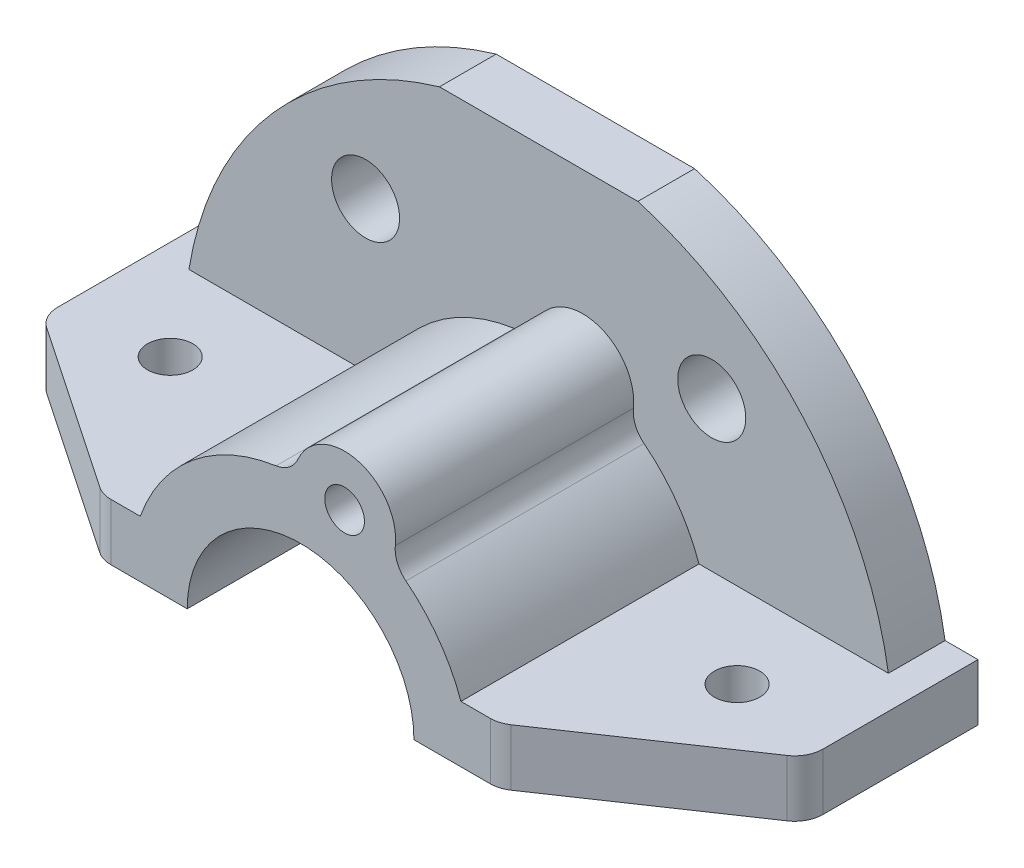
ISO-10303-21;
HEADER;
FILE_DESCRIPTION(('STEP AP214'),'2;1');
FILE_NAME('part.step','',(''),(''),'','','');
FILE_SCHEMA(('AUTOMOTIVE_DESIGN { 1 0 10303 214 1 1 1 1 }'));
ENDSEC;
DATA;
#1=APPLICATION_CONTEXT('core data for automotive mechanical design processes');
#2=APPLICATION_PROTOCOL_DEFINITION('international standard','automotive_design',2000,#1);
#3=PRODUCT_CONTEXT('',#1,'mechanical');
#4=PRODUCT('Part','Part','',(#3));
#5=PRODUCT_RELATED_PRODUCT_CATEGORY('part','',(#4));
#6=PRODUCT_DEFINITION_FORMATION('','',#4);
#7=PRODUCT_DEFINITION_CONTEXT('part definition',#1,'design');
#8=PRODUCT_DEFINITION('design','',#6,#7);
#9=PRODUCT_DEFINITION_SHAPE('','',#8);
#10=(LENGTH_UNIT() NAMED_UNIT(*) SI_UNIT(.MILLI.,.METRE.));
#11=(NAMED_UNIT(*) PLANE_ANGLE_UNIT() SI_UNIT($,.RADIAN.));
#12=(NAMED_UNIT(*) SI_UNIT($,.STERADIAN.) SOLID_ANGLE_UNIT());
#13=UNCERTAINTY_MEASURE_WITH_UNIT(LENGTH_MEASURE(1.E-05),#10,'distance_accuracy_value','');
#14=(GEOMETRIC_REPRESENTATION_CONTEXT(3) GLOBAL_UNCERTAINTY_ASSIGNED_CONTEXT((#13)) GLOBAL_UNIT_ASSIGNED_CONTEXT((#10,
#11,#12)) REPRESENTATION_CONTEXT('',''));
#15=CARTESIAN_POINT('',(0.,0.,0.));
#16=DIRECTION('',(0.,0.,1.));
#17=DIRECTION('',(1.,0.,0.));
#18=AXIS2_PLACEMENT_3D('',#15,#16,#17);
#19=CARTESIAN_POINT('',(67.5,9.99999999999999,-52.));
#20=DIRECTION('',(1.,0.,0.));
#21=DIRECTION('',(0.,0.,-1.));
#22=AXIS2_PLACEMENT_3D('',#19,#20,#21);
#23=PLANE('',#22);
#24=DIRECTION('',(0.,0.,1.));
#25=VECTOR('',#24,1.);
#26=CARTESIAN_POINT('',(67.5,9.99999999999999,-52.));
#27=LINE('',#26,#25);
#28=CARTESIAN_POINT('',(67.5,9.99999999999999,-52.));
#29=VERTEX_POINT('',#28);
#30=CARTESIAN_POINT('',(67.5,9.99999999999999,-24.6532336779047));
#31=VERTEX_POINT('',#30);
#32=EDGE_CURVE('E297',#29,#31,#27,.T.);
#33=ORIENTED_EDGE('',*,*,#32,.T.);
#34=DIRECTION('',(0.,-1.,0.));
#35=VECTOR('',#34,1.);
#36=CARTESIAN_POINT('',(67.5,9.99999999999999,-24.6532336779047));
#37=LINE('',#36,#35);
#38=CARTESIAN_POINT('',(67.5,0.,-24.6532336779047));
#39=VERTEX_POINT('',#38);
#40=EDGE_CURVE('E327',#31,#39,#37,.T.);
#41=ORIENTED_EDGE('',*,*,#40,.T.);
#42=DIRECTION('',(0.,0.,1.));
#43=VECTOR('',#42,1.);
#44=CARTESIAN_POINT('',(67.5,0.,-52.));
#45=LINE('',#44,#43);
#46=CARTESIAN_POINT('',(67.5,0.,-52.));
#47=VERTEX_POINT('',#46);
#48=EDGE_CURVE('E302',#47,#39,#45,.T.);
#49=ORIENTED_EDGE('',*,*,#48,.F.);
#50=DIRECTION('',(0.,1.,0.));
#51=VECTOR('',#50,1.);
#52=CARTESIAN_POINT('',(67.5,9.99999999999999,-52.));
#53=LINE('',#52,#51);
#54=EDGE_CURVE('E267',#47,#29,#53,.T.);
#55=ORIENTED_EDGE('',*,*,#54,.T.);
#56=EDGE_LOOP('',(#33,#41,#49,#55));
#57=FACE_BOUND('',#56,.T.);
#58=ADVANCED_FACE('F41',(#57),#23,.T.);
#59=CARTESIAN_POINT('',(0.,0.,0.));
#60=DIRECTION('',(0.,0.,1.));
#61=DIRECTION('',(1.,0.,0.));
#62=AXIS2_PLACEMENT_3D('',#59,#60,#61);
#63=PLANE('',#62);
#64=DIRECTION('',(1.,0.,0.));
#65=VECTOR('',#64,1.);
#66=CARTESIAN_POINT('',(67.5,0.,0.));
#67=LINE('',#66,#65);
#68=CARTESIAN_POINT('',(20.,0.,0.));
#69=VERTEX_POINT('',#68);
#70=CARTESIAN_POINT('',(33.4668138849135,0.,0.));
#71=VERTEX_POINT('',#70);
#72=EDGE_CURVE('E283',#69,#71,#67,.T.);
#73=ORIENTED_EDGE('',*,*,#72,.T.);
#74=DIRECTION('',(0.,-1.,0.));
#75=VECTOR('',#74,1.);
#76=CARTESIAN_POINT('',(33.4668138849135,0.,0.));
#77=LINE('',#76,#75);
#78=CARTESIAN_POINT('',(33.4668138849135,9.99999999999999,0.));
#79=VERTEX_POINT('',#78);
#80=EDGE_CURVE('E350',#71,#79,#77,.F.);
#81=ORIENTED_EDGE('',*,*,#80,.T.);
#82=DIRECTION('',(-1.,0.,0.));
#83=VECTOR('',#82,1.);
#84=CARTESIAN_POINT('',(28.2842712474619,9.99999999999999,0.));
#85=LINE('',#84,#83);
#86=CARTESIAN_POINT('',(28.2842712474619,9.99999999999999,0.));
#87=VERTEX_POINT('',#86);
#88=EDGE_CURVE('E290',#79,#87,#85,.T.);
#89=ORIENTED_EDGE('',*,*,#88,.T.);
#90=CARTESIAN_POINT('',(0.,0.,0.));
#91=DIRECTION('',(0.,0.,1.));
#92=DIRECTION('',(1.,0.,0.));
#93=AXIS2_PLACEMENT_3D('',#90,#91,#92);
#94=CIRCLE('',#93,30.);
#95=CARTESIAN_POINT('',(18.5859243455187,23.5491701811901,0.));
#96=VERTEX_POINT('',#95);
#97=EDGE_CURVE('E289',#87,#96,#94,.T.);
#98=ORIENTED_EDGE('',*,*,#97,.T.);
#99=CARTESIAN_POINT('',(21.6835784031052,27.4740318780551,0.));
#100=DIRECTION('',(0.,0.,1.));
#101=DIRECTION('',(1.,0.,0.));
#102=AXIS2_PLACEMENT_3D('',#99,#100,#101);
#103=CIRCLE('',#102,5.);
#104=CARTESIAN_POINT('',(16.7125044566661,28.0110829175612,0.));
#105=VERTEX_POINT('',#104);
#106=EDGE_CURVE('E11',#96,#105,#103,.F.);
#107=ORIENTED_EDGE('',*,*,#106,.T.);
#108=CARTESIAN_POINT('',(7.76457135307573,28.977774788672,0.));
#109=DIRECTION('',(0.,0.,1.));
#110=DIRECTION('',(1.,0.,0.));
#111=AXIS2_PLACEMENT_3D('',#108,#109,#110);
#112=CIRCLE('',#111,9.);
#113=CARTESIAN_POINT('',(-0.46791196155265,32.6145616224534,0.));
#114=VERTEX_POINT('',#113);
#115=EDGE_CURVE('E260',#105,#114,#112,.T.);
#116=ORIENTED_EDGE('',*,*,#115,.T.);
#117=CARTESIAN_POINT('',(-5.04151380301286,34.6349987523319,0.));
#118=DIRECTION('',(0.,0.,1.));
#119=DIRECTION('',(1.,0.,0.));
#120=AXIS2_PLACEMENT_3D('',#117,#118,#119);
#121=CIRCLE('',#120,5.);
#122=CARTESIAN_POINT('',(-4.32129754543959,29.687141787713,0.));
#123=VERTEX_POINT('',#122);
#124=EDGE_CURVE('E47',#114,#123,#121,.F.);
#125=ORIENTED_EDGE('',*,*,#124,.T.);
#126=CARTESIAN_POINT('',(0.,0.,0.));
#127=DIRECTION('',(0.,0.,1.));
#128=DIRECTION('',(1.,0.,0.));
#129=AXIS2_PLACEMENT_3D('',#126,#127,#128);
#130=CIRCLE('',#129,30.);
#131=CARTESIAN_POINT('',(-28.2842712474619,9.99999999999999,0.));
#132=VERTEX_POINT('',#131);
#133=EDGE_CURVE('E253',#123,#132,#130,.T.);
#134=ORIENTED_EDGE('',*,*,#133,.T.);
#135=DIRECTION('',(-1.,0.,0.));
#136=VECTOR('',#135,1.);
#137=CARTESIAN_POINT('',(-28.2842712474619,9.99999999999999,0.));
#138=LINE('',#137,#136);
#139=CARTESIAN_POINT('',(-33.4668138849135,9.99999999999999,0.));
#140=VERTEX_POINT('',#139);
#141=EDGE_CURVE('E277',#132,#140,#138,.T.);
#142=ORIENTED_EDGE('',*,*,#141,.T.);
#143=DIRECTION('',(0.,-1.,0.));
#144=VECTOR('',#143,1.);
#145=CARTESIAN_POINT('',(-33.4668138849135,0.,0.));
#146=LINE('',#145,#144);
#147=CARTESIAN_POINT('',(-33.4668138849135,0.,0.));
#148=VERTEX_POINT('',#147);
#149=EDGE_CURVE('E344',#140,#148,#146,.T.);
#150=ORIENTED_EDGE('',*,*,#149,.T.);
#151=DIRECTION('',(1.,0.,0.));
#152=VECTOR('',#151,1.);
#153=CARTESIAN_POINT('',(-67.5,0.,0.));
#154=LINE('',#153,#152);
#155=CARTESIAN_POINT('',(-20.,0.,0.));
#156=VERTEX_POINT('',#155);
#157=EDGE_CURVE('E276',#148,#156,#154,.T.);
#158=ORIENTED_EDGE('',*,*,#157,.T.);
#159=CARTESIAN_POINT('',(0.,0.,0.));
#160=DIRECTION('',(0.,0.,-1.));
#161=DIRECTION('',(1.,0.,0.));
#162=AXIS2_PLACEMENT_3D('',#159,#160,#161);
#163=CIRCLE('',#162,20.);
#164=EDGE_CURVE('E281',#156,#69,#163,.T.);
#165=ORIENTED_EDGE('',*,*,#164,.T.);
#166=EDGE_LOOP('',(#73,#81,#89,#98,#107,#116,#125,#134,#142,#150,#158,#165));
#167=FACE_BOUND('',#166,.T.);
#168=CARTESIAN_POINT('',(7.76457135307573,28.977774788672,0.));
#169=DIRECTION('',(0.,0.,1.));
#170=DIRECTION('',(1.,0.,0.));
#171=AXIS2_PLACEMENT_3D('',#168,#169,#170);
#172=CIRCLE('',#171,3.5);
#173=CARTESIAN_POINT('',(11.2645713530757,28.977774788672,0.));
#174=VERTEX_POINT('',#173);
#175=EDGE_CURVE('E244',#174,#174,#172,.T.);
#176=ORIENTED_EDGE('',*,*,#175,.F.);
#177=EDGE_LOOP('',(#176));
#178=FACE_BOUND('',#177,.T.);
#179=ADVANCED_FACE('F361',(#167,#178),#63,.T.);
#180=CARTESIAN_POINT('',(28.2842712474619,9.99999999999999,-52.));
#181=DIRECTION('',(0.,1.,0.));
#182=DIRECTION('',(0.,0.,1.));
#183=AXIS2_PLACEMENT_3D('',#180,#181,#182);
#184=PLANE('',#183);
#185=CARTESIAN_POINT('',(50.,10.,-27.));
#186=DIRECTION('',(0.,1.,0.));
#187=DIRECTION('',(0.,0.,1.));
#188=AXIS2_PLACEMENT_3D('',#185,#186,#187);
#189=CIRCLE('',#188,4.00000000000001);
#190=CARTESIAN_POINT('',(50.,10.,-23.));
#191=VERTEX_POINT('',#190);
#192=EDGE_CURVE('E431',#191,#191,#189,.T.);
#193=ORIENTED_EDGE('',*,*,#192,.F.);
#194=EDGE_LOOP('',(#193));
#195=FACE_BOUND('',#194,.T.);
#196=DIRECTION('',(-0.828109472135937,0.,0.560566411907403));
#197=VECTOR('',#196,1.);
#198=CARTESIAN_POINT('',(67.5,10.,-22.));
#199=LINE('',#198,#197);
#200=CARTESIAN_POINT('',(65.302832059537,10.,-20.5126863172251));
#201=VERTEX_POINT('',#200);
#202=CARTESIAN_POINT('',(36.2696459444505,10.,-0.859452639320323));
#203=VERTEX_POINT('',#202);
#204=EDGE_CURVE('E426',#201,#203,#199,.T.);
#205=ORIENTED_EDGE('',*,*,#204,.F.);
#206=CARTESIAN_POINT('',(62.5,9.99999999999999,-24.6532336779047));
#207=DIRECTION('',(0.,1.,0.));
#208=DIRECTION('',(0.,0.,1.));
#209=AXIS2_PLACEMENT_3D('',#206,#207,#208);
#210=CIRCLE('',#209,5.);
#211=EDGE_CURVE('E345',#201,#31,#210,.T.);
#212=ORIENTED_EDGE('',*,*,#211,.T.);
#213=ORIENTED_EDGE('',*,*,#32,.F.);
#214=DIRECTION('',(-1.,0.,0.));
#215=VECTOR('',#214,1.);
#216=CARTESIAN_POINT('',(28.2842712474619,9.99999999999999,-52.));
#217=LINE('',#216,#215);
#218=CARTESIAN_POINT('',(61.6948133962653,9.99999999999999,-52.));
#219=VERTEX_POINT('',#218);
#220=EDGE_CURVE('E275',#29,#219,#217,.T.);
#221=ORIENTED_EDGE('',*,*,#220,.T.);
#222=DIRECTION('',(0.,0.,1.));
#223=VECTOR('',#222,1.);
#224=CARTESIAN_POINT('',(61.6948133962653,9.99999999999999,-52.));
#225=LINE('',#224,#223);
#226=CARTESIAN_POINT('',(61.6948133962653,9.99999999999999,-42.));
#227=VERTEX_POINT('',#226);
#228=EDGE_CURVE('E201',#219,#227,#225,.T.);
#229=ORIENTED_EDGE('',*,*,#228,.T.);
#230=DIRECTION('',(1.,0.,0.));
#231=VECTOR('',#230,1.);
#232=CARTESIAN_POINT('',(61.6948133962653,9.99999999999999,-42.));
#233=LINE('',#232,#231);
#234=CARTESIAN_POINT('',(28.2842712474619,9.99999999999999,-42.));
#235=VERTEX_POINT('',#234);
#236=EDGE_CURVE('E239',#235,#227,#233,.T.);
#237=ORIENTED_EDGE('',*,*,#236,.F.);
#238=DIRECTION('',(0.,0.,1.));
#239=VECTOR('',#238,1.);
#240=CARTESIAN_POINT('',(28.2842712474619,9.99999999999999,-52.));
#241=LINE('',#240,#239);
#242=EDGE_CURVE('E294',#235,#87,#241,.T.);
#243=ORIENTED_EDGE('',*,*,#242,.T.);
#244=ORIENTED_EDGE('',*,*,#88,.F.);
#245=CARTESIAN_POINT('',(33.4668138849135,9.99999999999999,-5.));
#246=DIRECTION('',(0.,1.,0.));
#247=DIRECTION('',(0.,0.,1.));
#248=AXIS2_PLACEMENT_3D('',#245,#246,#247);
#249=CIRCLE('',#248,5.);
#250=EDGE_CURVE('E339',#79,#203,#249,.T.);
#251=ORIENTED_EDGE('',*,*,#250,.T.);
#252=EDGE_LOOP('',(#205,#212,#213,#221,#229,#237,#243,#244,#251));
#253=FACE_BOUND('',#252,.T.);
#254=ADVANCED_FACE('F393',(#195,#253),#184,.T.);
#255=CARTESIAN_POINT('',(-28.2842712474619,9.99999999999999,-52.));
#256=DIRECTION('',(0.,1.,0.));
#257=DIRECTION('',(-1.,0.,0.));
#258=AXIS2_PLACEMENT_3D('',#255,#256,#257);
#259=PLANE('',#258);
#260=CARTESIAN_POINT('',(-50.,10.,-27.));
#261=DIRECTION('',(0.,1.,0.));
#262=DIRECTION('',(0.,0.,-1.));
#263=AXIS2_PLACEMENT_3D('',#260,#261,#262);
#264=CIRCLE('',#263,4.00000000000001);
#265=CARTESIAN_POINT('',(-50.,10.,-31.));
#266=VERTEX_POINT('',#265);
#267=EDGE_CURVE('E411',#266,#266,#264,.T.);
#268=ORIENTED_EDGE('',*,*,#267,.F.);
#269=EDGE_LOOP('',(#268));
#270=FACE_BOUND('',#269,.T.);
#271=DIRECTION('',(-0.828109472135937,0.,-0.560566411907403));
#272=VECTOR('',#271,1.);
#273=CARTESIAN_POINT('',(-67.5,10.,-22.));
#274=LINE('',#273,#272);
#275=CARTESIAN_POINT('',(-36.2696459444505,10.,-0.859452639320319));
#276=VERTEX_POINT('',#275);
#277=CARTESIAN_POINT('',(-65.302832059537,10.,-20.5126863172251));
#278=VERTEX_POINT('',#277);
#279=EDGE_CURVE('E412',#276,#278,#274,.T.);
#280=ORIENTED_EDGE('',*,*,#279,.F.);
#281=CARTESIAN_POINT('',(-33.4668138849135,9.99999999999999,-5.));
#282=DIRECTION('',(0.,1.,0.));
#283=DIRECTION('',(-1.,0.,0.));
#284=AXIS2_PLACEMENT_3D('',#281,#282,#283);
#285=CIRCLE('',#284,5.);
#286=EDGE_CURVE('E359',#276,#140,#285,.T.);
#287=ORIENTED_EDGE('',*,*,#286,.T.);
#288=ORIENTED_EDGE('',*,*,#141,.F.);
#289=DIRECTION('',(0.,0.,1.));
#290=VECTOR('',#289,1.);
#291=CARTESIAN_POINT('',(-28.2842712474619,9.99999999999999,-52.));
#292=LINE('',#291,#290);
#293=CARTESIAN_POINT('',(-28.2842712474619,9.99999999999999,-42.));
#294=VERTEX_POINT('',#293);
#295=EDGE_CURVE('E273',#294,#132,#292,.T.);
#296=ORIENTED_EDGE('',*,*,#295,.F.);
#297=DIRECTION('',(1.,0.,0.));
#298=VECTOR('',#297,1.);
#299=CARTESIAN_POINT('',(-28.2842712474619,9.99999999999999,-42.));
#300=LINE('',#299,#298);
#301=CARTESIAN_POINT('',(-61.6948133962653,9.99999999999999,-42.));
#302=VERTEX_POINT('',#301);
#303=EDGE_CURVE('E230',#302,#294,#300,.T.);
#304=ORIENTED_EDGE('',*,*,#303,.F.);
#305=DIRECTION('',(0.,0.,1.));
#306=VECTOR('',#305,1.);
#307=CARTESIAN_POINT('',(-61.6948133962653,9.99999999999999,-52.));
#308=LINE('',#307,#306);
#309=CARTESIAN_POINT('',(-61.6948133962653,9.99999999999999,-52.));
#310=VERTEX_POINT('',#309);
#311=EDGE_CURVE('E217',#310,#302,#308,.T.);
#312=ORIENTED_EDGE('',*,*,#311,.F.);
#313=DIRECTION('',(-1.,0.,0.));
#314=VECTOR('',#313,1.);
#315=CARTESIAN_POINT('',(-28.2842712474619,9.99999999999999,-52.));
#316=LINE('',#315,#314);
#317=CARTESIAN_POINT('',(-67.5,9.99999999999999,-52.));
#318=VERTEX_POINT('',#317);
#319=EDGE_CURVE('E255',#310,#318,#316,.T.);
#320=ORIENTED_EDGE('',*,*,#319,.T.);
#321=DIRECTION('',(0.,0.,1.));
#322=VECTOR('',#321,1.);
#323=CARTESIAN_POINT('',(-67.5,9.99999999999999,-52.));
#324=LINE('',#323,#322);
#325=CARTESIAN_POINT('',(-67.5,9.99999999999999,-24.6532336779047));
#326=VERTEX_POINT('',#325);
#327=EDGE_CURVE('E313',#318,#326,#324,.T.);
#328=ORIENTED_EDGE('',*,*,#327,.T.);
#329=CARTESIAN_POINT('',(-62.5,9.99999999999999,-24.6532336779047));
#330=DIRECTION('',(0.,1.,0.));
#331=DIRECTION('',(-1.,0.,0.));
#332=AXIS2_PLACEMENT_3D('',#329,#330,#331);
#333=CIRCLE('',#332,5.);
#334=EDGE_CURVE('E62',#326,#278,#333,.T.);
#335=ORIENTED_EDGE('',*,*,#334,.T.);
#336=EDGE_LOOP('',(#280,#287,#288,#296,#304,#312,#320,#328,#335));
#337=FACE_BOUND('',#336,.T.);
#338=ADVANCED_FACE('F398',(#270,#337),#259,.T.);
#339=CARTESIAN_POINT('',(0.,0.,-52.));
#340=DIRECTION('',(0.,0.,1.));
#341=DIRECTION('',(1.,0.,0.));
#342=AXIS2_PLACEMENT_3D('',#339,#340,#341);
#343=CYLINDRICAL_SURFACE('',#342,30.);
#344=ORIENTED_EDGE('',*,*,#133,.F.);
#345=DIRECTION('',(0.,0.,1.));
#346=VECTOR('',#345,1.);
#347=CARTESIAN_POINT('',(-4.32129754543959,29.687141787713,-52.));
#348=LINE('',#347,#346);
#349=CARTESIAN_POINT('',(-4.32129754543959,29.687141787713,-42.));
#350=VERTEX_POINT('',#349);
#351=EDGE_CURVE('E317',#123,#350,#348,.F.);
#352=ORIENTED_EDGE('',*,*,#351,.T.);
#353=CARTESIAN_POINT('',(0.,0.,-42.));
#354=DIRECTION('',(0.,0.,-1.));
#355=DIRECTION('',(1.,0.,0.));
#356=AXIS2_PLACEMENT_3D('',#353,#354,#355);
#357=CIRCLE('',#356,30.);
#358=EDGE_CURVE('E232',#294,#350,#357,.T.);
#359=ORIENTED_EDGE('',*,*,#358,.F.);
#360=ORIENTED_EDGE('',*,*,#295,.T.);
#361=EDGE_LOOP('',(#344,#352,#359,#360));
#362=FACE_BOUND('',#361,.T.);
#363=ADVANCED_FACE('F367',(#362),#343,.T.);
#364=CARTESIAN_POINT('',(7.76457135307573,28.977774788672,-52.));
#365=DIRECTION('',(0.,0.,1.));
#366=DIRECTION('',(1.,0.,0.));
#367=AXIS2_PLACEMENT_3D('',#364,#365,#366);
#368=CYLINDRICAL_SURFACE('',#367,9.);
#369=CARTESIAN_POINT('',(7.76457135307573,28.977774788672,-42.));
#370=DIRECTION('',(0.,0.,-1.));
#371=DIRECTION('',(1.,0.,0.));
#372=AXIS2_PLACEMENT_3D('',#369,#370,#371);
#373=CIRCLE('',#372,9.);
#374=CARTESIAN_POINT('',(-0.46791196155265,32.6145616224534,-42.));
#375=VERTEX_POINT('',#374);
#376=CARTESIAN_POINT('',(16.7125044566661,28.0110829175612,-42.));
#377=VERTEX_POINT('',#376);
#378=EDGE_CURVE('E234',#375,#377,#373,.T.);
#379=ORIENTED_EDGE('',*,*,#378,.F.);
#380=DIRECTION('',(0.,0.,1.));
#381=VECTOR('',#380,1.);
#382=CARTESIAN_POINT('',(-0.46791196155265,32.6145616224534,-52.));
#383=LINE('',#382,#381);
#384=EDGE_CURVE('E316',#375,#114,#383,.T.);
#385=ORIENTED_EDGE('',*,*,#384,.T.);
#386=ORIENTED_EDGE('',*,*,#115,.F.);
#387=DIRECTION('',(0.,0.,1.));
#388=VECTOR('',#387,1.);
#389=CARTESIAN_POINT('',(16.7125044566661,28.0110829175612,-52.));
#390=LINE('',#389,#388);
#391=EDGE_CURVE('E300',#105,#377,#390,.F.);
#392=ORIENTED_EDGE('',*,*,#391,.T.);
#393=EDGE_LOOP('',(#379,#385,#386,#392));
#394=FACE_BOUND('',#393,.T.);
#395=ADVANCED_FACE('F379',(#394),#368,.T.);
#396=CARTESIAN_POINT('',(0.,0.,-52.));
#397=DIRECTION('',(0.,0.,1.));
#398=DIRECTION('',(1.,0.,0.));
#399=AXIS2_PLACEMENT_3D('',#396,#397,#398);
#400=CYLINDRICAL_SURFACE('',#399,30.);
#401=CARTESIAN_POINT('',(0.,0.,-42.));
#402=DIRECTION('',(0.,0.,-1.));
#403=DIRECTION('',(1.,0.,0.));
#404=AXIS2_PLACEMENT_3D('',#401,#402,#403);
#405=CIRCLE('',#404,30.);
#406=CARTESIAN_POINT('',(18.5859243455187,23.5491701811901,-42.));
#407=VERTEX_POINT('',#406);
#408=EDGE_CURVE('E240',#407,#235,#405,.T.);
#409=ORIENTED_EDGE('',*,*,#408,.F.);
#410=DIRECTION('',(0.,0.,1.));
#411=VECTOR('',#410,1.);
#412=CARTESIAN_POINT('',(18.5859243455187,23.5491701811901,-52.));
#413=LINE('',#412,#411);
#414=EDGE_CURVE('E324',#407,#96,#413,.T.);
#415=ORIENTED_EDGE('',*,*,#414,.T.);
#416=ORIENTED_EDGE('',*,*,#97,.F.);
#417=ORIENTED_EDGE('',*,*,#242,.F.);
#418=EDGE_LOOP('',(#409,#415,#416,#417));
#419=FACE_BOUND('',#418,.T.);
#420=ADVANCED_FACE('F389',(#419),#400,.T.);
#421=CARTESIAN_POINT('',(67.5,0.,-52.));
#422=DIRECTION('',(0.,-1.,0.));
#423=DIRECTION('',(1.,0.,0.));
#424=AXIS2_PLACEMENT_3D('',#421,#422,#423);
#425=PLANE('',#424);
#426=CARTESIAN_POINT('',(50.,0.,-27.));
#427=DIRECTION('',(0.,1.,0.));
#428=DIRECTION('',(0.,0.,1.));
#429=AXIS2_PLACEMENT_3D('',#426,#427,#428);
#430=CIRCLE('',#429,4.00000000000001);
#431=CARTESIAN_POINT('',(50.,0.,-23.));
#432=VERTEX_POINT('',#431);
#433=EDGE_CURVE('E422',#432,#432,#430,.T.);
#434=ORIENTED_EDGE('',*,*,#433,.T.);
#435=EDGE_LOOP('',(#434));
#436=FACE_BOUND('',#435,.T.);
#437=ORIENTED_EDGE('',*,*,#48,.T.);
#438=CARTESIAN_POINT('',(62.5,0.,-24.6532336779047));
#439=DIRECTION('',(0.,-1.,0.));
#440=DIRECTION('',(1.,0.,0.));
#441=AXIS2_PLACEMENT_3D('',#438,#439,#440);
#442=CIRCLE('',#441,5.);
#443=CARTESIAN_POINT('',(65.302832059537,0.,-20.5126863172251));
#444=VERTEX_POINT('',#443);
#445=EDGE_CURVE('E334',#39,#444,#442,.T.);
#446=ORIENTED_EDGE('',*,*,#445,.T.);
#447=DIRECTION('',(-0.828109472135937,0.,0.560566411907403));
#448=VECTOR('',#447,1.);
#449=CARTESIAN_POINT('',(67.5,0.,-22.));
#450=LINE('',#449,#448);
#451=CARTESIAN_POINT('',(36.2696459444505,0.,-0.859452639320323));
#452=VERTEX_POINT('',#451);
#453=EDGE_CURVE('E425',#444,#452,#450,.T.);
#454=ORIENTED_EDGE('',*,*,#453,.T.);
#455=CARTESIAN_POINT('',(33.4668138849135,0.,-5.));
#456=DIRECTION('',(0.,-1.,0.));
#457=DIRECTION('',(1.,0.,0.));
#458=AXIS2_PLACEMENT_3D('',#455,#456,#457);
#459=CIRCLE('',#458,5.);
#460=EDGE_CURVE('E332',#452,#71,#459,.T.);
#461=ORIENTED_EDGE('',*,*,#460,.T.);
#462=ORIENTED_EDGE('',*,*,#72,.F.);
#463=DIRECTION('',(0.,0.,1.));
#464=VECTOR('',#463,1.);
#465=CARTESIAN_POINT('',(20.,0.,-52.));
#466=LINE('',#465,#464);
#467=CARTESIAN_POINT('',(20.,0.,-52.));
#468=VERTEX_POINT('',#467);
#469=EDGE_CURVE('E304',#468,#69,#466,.T.);
#470=ORIENTED_EDGE('',*,*,#469,.F.);
#471=DIRECTION('',(1.,0.,0.));
#472=VECTOR('',#471,1.);
#473=CARTESIAN_POINT('',(67.5,0.,-52.));
#474=LINE('',#473,#472);
#475=EDGE_CURVE('E266',#468,#47,#474,.T.);
#476=ORIENTED_EDGE('',*,*,#475,.T.);
#477=EDGE_LOOP('',(#437,#446,#454,#461,#462,#470,#476));
#478=FACE_BOUND('',#477,.T.);
#479=ADVANCED_FACE('F478',(#436,#478),#425,.T.);
#480=CARTESIAN_POINT('',(0.,0.,-52.));
#481=DIRECTION('',(0.,0.,1.));
#482=DIRECTION('',(1.,0.,0.));
#483=AXIS2_PLACEMENT_3D('',#480,#481,#482);
#484=CYLINDRICAL_SURFACE('',#483,20.);
#485=ORIENTED_EDGE('',*,*,#164,.F.);
#486=DIRECTION('',(0.,0.,1.));
#487=VECTOR('',#486,1.);
#488=CARTESIAN_POINT('',(-20.,0.,-52.));
#489=LINE('',#488,#487);
#490=CARTESIAN_POINT('',(-20.,0.,-52.));
#491=VERTEX_POINT('',#490);
#492=EDGE_CURVE('E308',#491,#156,#489,.T.);
#493=ORIENTED_EDGE('',*,*,#492,.F.);
#494=CARTESIAN_POINT('',(0.,0.,-52.));
#495=DIRECTION('',(0.,0.,-1.));
#496=DIRECTION('',(1.,0.,0.));
#497=AXIS2_PLACEMENT_3D('',#494,#495,#496);
#498=CIRCLE('',#497,20.);
#499=EDGE_CURVE('E263',#491,#468,#498,.T.);
#500=ORIENTED_EDGE('',*,*,#499,.T.);
#501=ORIENTED_EDGE('',*,*,#469,.T.);
#502=EDGE_LOOP('',(#485,#493,#500,#501));
#503=FACE_BOUND('',#502,.T.);
#504=ADVANCED_FACE('F479',(#503),#484,.F.);
#505=CARTESIAN_POINT('',(-67.5,0.,-52.));
#506=DIRECTION('',(0.,-1.,0.));
#507=DIRECTION('',(0.,0.,-1.));
#508=AXIS2_PLACEMENT_3D('',#505,#506,#507);
#509=PLANE('',#508);
#510=CARTESIAN_POINT('',(-50.,0.,-27.));
#511=DIRECTION('',(0.,1.,0.));
#512=DIRECTION('',(0.,0.,-1.));
#513=AXIS2_PLACEMENT_3D('',#510,#511,#512);
#514=CIRCLE('',#513,4.00000000000001);
#515=CARTESIAN_POINT('',(-50.,0.,-31.));
#516=VERTEX_POINT('',#515);
#517=EDGE_CURVE('E416',#516,#516,#514,.T.);
#518=ORIENTED_EDGE('',*,*,#517,.T.);
#519=EDGE_LOOP('',(#518));
#520=FACE_BOUND('',#519,.T.);
#521=ORIENTED_EDGE('',*,*,#157,.F.);
#522=CARTESIAN_POINT('',(-33.4668138849135,0.,-5.));
#523=DIRECTION('',(0.,-1.,0.));
#524=DIRECTION('',(0.,0.,-1.));
#525=AXIS2_PLACEMENT_3D('',#522,#523,#524);
#526=CIRCLE('',#525,5.);
#527=CARTESIAN_POINT('',(-36.2696459444505,0.,-0.859452639320319));
#528=VERTEX_POINT('',#527);
#529=EDGE_CURVE('E351',#148,#528,#526,.T.);
#530=ORIENTED_EDGE('',*,*,#529,.T.);
#531=DIRECTION('',(-0.828109472135937,0.,-0.560566411907403));
#532=VECTOR('',#531,1.);
#533=CARTESIAN_POINT('',(-67.5,0.,-22.));
#534=LINE('',#533,#532);
#535=CARTESIAN_POINT('',(-65.302832059537,0.,-20.5126863172251));
#536=VERTEX_POINT('',#535);
#537=EDGE_CURVE('E408',#528,#536,#534,.T.);
#538=ORIENTED_EDGE('',*,*,#537,.T.);
#539=CARTESIAN_POINT('',(-62.5,0.,-24.6532336779047));
#540=DIRECTION('',(0.,-1.,0.));
#541=DIRECTION('',(0.,0.,-1.));
#542=AXIS2_PLACEMENT_3D('',#539,#540,#541);
#543=CIRCLE('',#542,5.);
#544=CARTESIAN_POINT('',(-67.5,0.,-24.6532336779047));
#545=VERTEX_POINT('',#544);
#546=EDGE_CURVE('E349',#536,#545,#543,.T.);
#547=ORIENTED_EDGE('',*,*,#546,.T.);
#548=DIRECTION('',(0.,0.,1.));
#549=VECTOR('',#548,1.);
#550=CARTESIAN_POINT('',(-67.5,0.,-52.));
#551=LINE('',#550,#549);
#552=CARTESIAN_POINT('',(-67.5,0.,-52.));
#553=VERTEX_POINT('',#552);
#554=EDGE_CURVE('E310',#553,#545,#551,.T.);
#555=ORIENTED_EDGE('',*,*,#554,.F.);
#556=DIRECTION('',(1.,0.,0.));
#557=VECTOR('',#556,1.);
#558=CARTESIAN_POINT('',(-67.5,0.,-52.));
#559=LINE('',#558,#557);
#560=EDGE_CURVE('E257',#553,#491,#559,.T.);
#561=ORIENTED_EDGE('',*,*,#560,.T.);
#562=ORIENTED_EDGE('',*,*,#492,.T.);
#563=EDGE_LOOP('',(#521,#530,#538,#547,#555,#561,#562));
#564=FACE_BOUND('',#563,.T.);
#565=ADVANCED_FACE('F414',(#520,#564),#509,.T.);
#566=CARTESIAN_POINT('',(-67.5,9.99999999999999,-52.));
#567=DIRECTION('',(-1.,0.,0.));
#568=DIRECTION('',(0.,0.,1.));
#569=AXIS2_PLACEMENT_3D('',#566,#567,#568);
#570=PLANE('',#569);
#571=ORIENTED_EDGE('',*,*,#554,.T.);
#572=DIRECTION('',(0.,-1.,0.));
#573=VECTOR('',#572,1.);
#574=CARTESIAN_POINT('',(-67.5,9.99999999999999,-24.6532336779047));
#575=LINE('',#574,#573);
#576=EDGE_CURVE('E57',#545,#326,#575,.F.);
#577=ORIENTED_EDGE('',*,*,#576,.T.);
#578=ORIENTED_EDGE('',*,*,#327,.F.);
#579=DIRECTION('',(0.,-1.,0.));
#580=VECTOR('',#579,1.);
#581=CARTESIAN_POINT('',(-67.5,9.99999999999999,-52.));
#582=LINE('',#581,#580);
#583=EDGE_CURVE('E258',#318,#553,#582,.T.);
#584=ORIENTED_EDGE('',*,*,#583,.T.);
#585=EDGE_LOOP('',(#571,#577,#578,#584));
#586=FACE_BOUND('',#585,.T.);
#587=ADVANCED_FACE('F405',(#586),#570,.T.);
#588=CARTESIAN_POINT('',(0.,0.,-52.));
#589=DIRECTION('',(0.,0.,1.));
#590=DIRECTION('',(1.,0.,0.));
#591=AXIS2_PLACEMENT_3D('',#588,#589,#590);
#592=PLANE('',#591);
#593=CARTESIAN_POINT('',(0.,0.,-52.));
#594=DIRECTION('',(0.,0.,1.));
#595=DIRECTION('',(1.,0.,0.));
#596=AXIS2_PLACEMENT_3D('',#593,#594,#595);
#597=CIRCLE('',#596,62.5);
#598=CARTESIAN_POINT('',(17.5,60.,-52.));
#599=VERTEX_POINT('',#598);
#600=EDGE_CURVE('E210',#219,#599,#597,.T.);
#601=ORIENTED_EDGE('',*,*,#600,.F.);
#602=ORIENTED_EDGE('',*,*,#220,.F.);
#603=ORIENTED_EDGE('',*,*,#54,.F.);
#604=ORIENTED_EDGE('',*,*,#475,.F.);
#605=ORIENTED_EDGE('',*,*,#499,.F.);
#606=ORIENTED_EDGE('',*,*,#560,.F.);
#607=ORIENTED_EDGE('',*,*,#583,.F.);
#608=ORIENTED_EDGE('',*,*,#319,.F.);
#609=CARTESIAN_POINT('',(0.,0.,-52.));
#610=DIRECTION('',(0.,0.,1.));
#611=DIRECTION('',(1.,0.,0.));
#612=AXIS2_PLACEMENT_3D('',#609,#610,#611);
#613=CIRCLE('',#612,62.5);
#614=CARTESIAN_POINT('',(-17.5,60.,-52.));
#615=VERTEX_POINT('',#614);
#616=EDGE_CURVE('E211',#615,#310,#613,.T.);
#617=ORIENTED_EDGE('',*,*,#616,.F.);
#618=DIRECTION('',(-1.,0.,0.));
#619=VECTOR('',#618,1.);
#620=CARTESIAN_POINT('',(17.5,60.,-52.));
#621=LINE('',#620,#619);
#622=EDGE_CURVE('E198',#599,#615,#621,.T.);
#623=ORIENTED_EDGE('',*,*,#622,.F.);
#624=EDGE_LOOP('',(#601,#602,#603,#604,#605,#606,#607,#608,#617,#623));
#625=FACE_BOUND('',#624,.T.);
#626=CARTESIAN_POINT('',(7.76457135307573,28.977774788672,-52.));
#627=DIRECTION('',(0.,0.,1.));
#628=DIRECTION('',(1.,0.,0.));
#629=AXIS2_PLACEMENT_3D('',#626,#627,#628);
#630=CIRCLE('',#629,3.5);
#631=CARTESIAN_POINT('',(11.2645713530757,28.977774788672,-52.));
#632=VERTEX_POINT('',#631);
#633=EDGE_CURVE('E248',#632,#632,#630,.T.);
#634=ORIENTED_EDGE('',*,*,#633,.T.);
#635=EDGE_LOOP('',(#634));
#636=FACE_BOUND('',#635,.T.);
#637=CARTESIAN_POINT('',(30.5324114601106,36.3871110481515,-52.));
#638=DIRECTION('',(0.,0.,1.));
#639=DIRECTION('',(1.,0.,0.));
#640=AXIS2_PLACEMENT_3D('',#637,#638,#639);
#641=CIRCLE('',#640,6.);
#642=CARTESIAN_POINT('',(36.5324114601106,36.3871110481515,-52.));
#643=VERTEX_POINT('',#642);
#644=EDGE_CURVE('E440',#643,#643,#641,.T.);
#645=ORIENTED_EDGE('',*,*,#644,.T.);
#646=EDGE_LOOP('',(#645));
#647=FACE_BOUND('',#646,.T.);
#648=CARTESIAN_POINT('',(-30.5324114601106,36.3871110481515,-52.));
#649=DIRECTION('',(0.,0.,1.));
#650=DIRECTION('',(-1.,0.,0.));
#651=AXIS2_PLACEMENT_3D('',#648,#649,#650);
#652=CIRCLE('',#651,6.);
#653=CARTESIAN_POINT('',(-36.5324114601106,36.3871110481515,-52.));
#654=VERTEX_POINT('',#653);
#655=EDGE_CURVE('E227',#654,#654,#652,.T.);
#656=ORIENTED_EDGE('',*,*,#655,.T.);
#657=EDGE_LOOP('',(#656));
#658=FACE_BOUND('',#657,.T.);
#659=ADVANCED_FACE('F212',(#625,#636,#647,#658),#592,.F.);
#660=CARTESIAN_POINT('',(7.76457135307573,28.977774788672,-52.));
#661=DIRECTION('',(0.,0.,1.));
#662=DIRECTION('',(1.,0.,0.));
#663=AXIS2_PLACEMENT_3D('',#660,#661,#662);
#664=CYLINDRICAL_SURFACE('',#663,3.5);
#665=CARTESIAN_POINT('',(11.2645713530757,28.977774788672,-52.));
#666=CARTESIAN_POINT('',(11.2645713530757,28.977774788672,-51.4583333333333));
#667=CARTESIAN_POINT('',(11.2645713530757,28.977774788672,-50.9166666666667));
#668=CARTESIAN_POINT('',(11.2645713530757,28.977774788672,-49.8333333333333));
#669=CARTESIAN_POINT('',(11.2645713530757,28.977774788672,-49.2916666666667));
#670=CARTESIAN_POINT('',(11.2645713530757,28.977774788672,-48.2083333333333));
#671=CARTESIAN_POINT('',(11.2645713530757,28.977774788672,-47.6666666666667));
#672=CARTESIAN_POINT('',(11.2645713530757,28.977774788672,-46.5833333333333));
#673=CARTESIAN_POINT('',(11.2645713530757,28.977774788672,-46.0416666666667));
#674=CARTESIAN_POINT('',(11.2645713530757,28.977774788672,-44.9583333333333));
#675=CARTESIAN_POINT('',(11.2645713530757,28.977774788672,-44.4166666666667));
#676=CARTESIAN_POINT('',(11.2645713530757,28.977774788672,-43.3333333333333));
#677=CARTESIAN_POINT('',(11.2645713530757,28.977774788672,-42.7916666666667));
#678=CARTESIAN_POINT('',(11.2645713530757,28.977774788672,-41.7083333333333));
#679=CARTESIAN_POINT('',(11.2645713530757,28.977774788672,-41.1666666666667));
#680=CARTESIAN_POINT('',(11.2645713530757,28.977774788672,-40.0833333333333));
#681=CARTESIAN_POINT('',(11.2645713530757,28.977774788672,-39.5416666666667));
#682=CARTESIAN_POINT('',(11.2645713530757,28.977774788672,-38.4583333333333));
#683=CARTESIAN_POINT('',(11.2645713530757,28.977774788672,-37.9166666666667));
#684=CARTESIAN_POINT('',(11.2645713530757,28.977774788672,-36.8333333333333));
#685=CARTESIAN_POINT('',(11.2645713530757,28.977774788672,-36.2916666666667));
#686=CARTESIAN_POINT('',(11.2645713530757,28.977774788672,-35.2083333333333));
#687=CARTESIAN_POINT('',(11.2645713530757,28.977774788672,-34.6666666666667));
#688=CARTESIAN_POINT('',(11.2645713530757,28.977774788672,-33.5833333333333));
#689=CARTESIAN_POINT('',(11.2645713530757,28.977774788672,-33.0416666666667));
#690=CARTESIAN_POINT('',(11.2645713530757,28.977774788672,-31.9583333333333));
#691=CARTESIAN_POINT('',(11.2645713530757,28.977774788672,-31.4166666666667));
#692=CARTESIAN_POINT('',(11.2645713530757,28.977774788672,-30.3333333333333));
#693=CARTESIAN_POINT('',(11.2645713530757,28.977774788672,-29.7916666666667));
#694=CARTESIAN_POINT('',(11.2645713530757,28.977774788672,-28.7083333333333));
#695=CARTESIAN_POINT('',(11.2645713530757,28.977774788672,-28.1666666666667));
#696=CARTESIAN_POINT('',(11.2645713530757,28.977774788672,-27.0833333333333));
#697=CARTESIAN_POINT('',(11.2645713530757,28.977774788672,-26.5416666666667));
#698=CARTESIAN_POINT('',(11.2645713530757,28.977774788672,-25.4583333333333));
#699=CARTESIAN_POINT('',(11.2645713530757,28.977774788672,-24.9166666666667));
#700=CARTESIAN_POINT('',(11.2645713530757,28.977774788672,-23.8333333333333));
#701=CARTESIAN_POINT('',(11.2645713530757,28.977774788672,-23.2916666666667));
#702=CARTESIAN_POINT('',(11.2645713530757,28.977774788672,-22.2083333333333));
#703=CARTESIAN_POINT('',(11.2645713530757,28.977774788672,-21.6666666666667));
#704=CARTESIAN_POINT('',(11.2645713530757,28.977774788672,-20.5833333333333));
#705=CARTESIAN_POINT('',(11.2645713530757,28.977774788672,-20.0416666666667));
#706=CARTESIAN_POINT('',(11.2645713530757,28.977774788672,-18.9583333333333));
#707=CARTESIAN_POINT('',(11.2645713530757,28.977774788672,-18.4166666666667));
#708=CARTESIAN_POINT('',(11.2645713530757,28.977774788672,-17.3333333333333));
#709=CARTESIAN_POINT('',(11.2645713530757,28.977774788672,-16.7916666666667));
#710=CARTESIAN_POINT('',(11.2645713530757,28.977774788672,-15.7083333333333));
#711=CARTESIAN_POINT('',(11.2645713530757,28.977774788672,-15.1666666666667));
#712=CARTESIAN_POINT('',(11.2645713530757,28.977774788672,-14.0833333333333));
#713=CARTESIAN_POINT('',(11.2645713530757,28.977774788672,-13.5416666666667));
#714=CARTESIAN_POINT('',(11.2645713530757,28.977774788672,-12.4583333333333));
#715=CARTESIAN_POINT('',(11.2645713530757,28.977774788672,-11.9166666666667));
#716=CARTESIAN_POINT('',(11.2645713530757,28.977774788672,-10.8333333333333));
#717=CARTESIAN_POINT('',(11.2645713530757,28.977774788672,-10.2916666666667));
#718=CARTESIAN_POINT('',(11.2645713530757,28.977774788672,-9.20833333333333));
#719=CARTESIAN_POINT('',(11.2645713530757,28.977774788672,-8.66666666666667));
#720=CARTESIAN_POINT('',(11.2645713530757,28.977774788672,-7.58333333333333));
#721=CARTESIAN_POINT('',(11.2645713530757,28.977774788672,-7.04166666666667));
#722=CARTESIAN_POINT('',(11.2645713530757,28.977774788672,-5.95833333333333));
#723=CARTESIAN_POINT('',(11.2645713530757,28.977774788672,-5.41666666666667));
#724=CARTESIAN_POINT('',(11.2645713530757,28.977774788672,-4.33333333333333));
#725=CARTESIAN_POINT('',(11.2645713530757,28.977774788672,-3.79166666666667));
#726=CARTESIAN_POINT('',(11.2645713530757,28.977774788672,-2.70833333333334));
#727=CARTESIAN_POINT('',(11.2645713530757,28.977774788672,-2.16666666666667));
#728=CARTESIAN_POINT('',(11.2645713530757,28.977774788672,-1.08333333333333));
#729=CARTESIAN_POINT('',(11.2645713530757,28.977774788672,-0.541666666666667));
#730=CARTESIAN_POINT('',(11.2645713530757,28.977774788672,0.));
#731=B_SPLINE_CURVE_WITH_KNOTS('',3,(#665,#666,#667,#668,#669,#670,#671,#672,#673,#674,#675,
#676,#677,#678,#679,#680,#681,#682,#683,#684,#685,#686,#687,#688,#689,#690,#691,#692,#693,#694,
#695,#696,#697,#698,#699,#700,#701,#702,#703,#704,#705,#706,#707,#708,#709,#710,#711,#712,#713,
#714,#715,#716,#717,#718,#719,#720,#721,#722,#723,#724,#725,#726,#727,#728,#729,#730),
.UNSPECIFIED.,.F.,.F.,(4,2,2,2,2,2,2,2,2,2,2,2,2,2,2,2,2,2,2,2,2,2,2,2,2,2,2,2,2,2,2,2,4),(0.,
1.62499999999999,3.25,4.875,6.5,8.12499999999999,9.74999999999999,11.375,13.,14.625,16.25,
17.875,19.5,21.125,22.75,24.375,26.,27.625,29.25,30.875,32.5,34.125,35.75,37.375,39.,40.625,
42.25,43.875,45.5,47.125,48.75,50.375,52.),.UNSPECIFIED.);
#732=EDGE_CURVE('BSEAM547',#632,#174,#731,.T.);
#733=ORIENTED_EDGE('',*,*,#633,.F.);
#734=ORIENTED_EDGE('',*,*,#175,.T.);
#735=ORIENTED_EDGE('',*,*,#732,.T.);
#736=ORIENTED_EDGE('',*,*,#732,.F.);
#737=EDGE_LOOP('',(#733,#735,#734,#736));
#738=FACE_BOUND('',#737,.T.);
#739=ADVANCED_FACE('F547',(#738),#664,.F.);
#740=CARTESIAN_POINT('',(0.,0.,-52.));
#741=DIRECTION('',(0.,0.,1.));
#742=DIRECTION('',(1.,0.,0.));
#743=AXIS2_PLACEMENT_3D('',#740,#741,#742);
#744=CYLINDRICAL_SURFACE('',#743,62.5);
#745=CARTESIAN_POINT('',(0.,0.,-42.));
#746=DIRECTION('',(0.,0.,1.));
#747=DIRECTION('',(1.,0.,0.));
#748=AXIS2_PLACEMENT_3D('',#745,#746,#747);
#749=CIRCLE('',#748,62.5);
#750=CARTESIAN_POINT('',(-17.5,60.,-42.));
#751=VERTEX_POINT('',#750);
#752=EDGE_CURVE('E221',#751,#302,#749,.T.);
#753=ORIENTED_EDGE('',*,*,#752,.F.);
#754=DIRECTION('',(0.,0.,1.));
#755=VECTOR('',#754,1.);
#756=CARTESIAN_POINT('',(-17.5,60.,-52.));
#757=LINE('',#756,#755);
#758=EDGE_CURVE('E205',#615,#751,#757,.T.);
#759=ORIENTED_EDGE('',*,*,#758,.F.);
#760=ORIENTED_EDGE('',*,*,#616,.T.);
#761=ORIENTED_EDGE('',*,*,#311,.T.);
#762=EDGE_LOOP('',(#753,#759,#760,#761));
#763=FACE_BOUND('',#762,.T.);
#764=ADVANCED_FACE('F400',(#763),#744,.T.);
#765=CARTESIAN_POINT('',(17.5,60.,-52.));
#766=DIRECTION('',(0.,1.,0.));
#767=DIRECTION('',(0.,0.,1.));
#768=AXIS2_PLACEMENT_3D('',#765,#766,#767);
#769=PLANE('',#768);
#770=DIRECTION('',(-1.,0.,0.));
#771=VECTOR('',#770,1.);
#772=CARTESIAN_POINT('',(17.5,60.,-42.));
#773=LINE('',#772,#771);
#774=CARTESIAN_POINT('',(17.5,60.,-42.));
#775=VERTEX_POINT('',#774);
#776=EDGE_CURVE('E196',#775,#751,#773,.T.);
#777=ORIENTED_EDGE('',*,*,#776,.F.);
#778=DIRECTION('',(0.,0.,1.));
#779=VECTOR('',#778,1.);
#780=CARTESIAN_POINT('',(17.5,60.,-52.));
#781=LINE('',#780,#779);
#782=EDGE_CURVE('E195',#599,#775,#781,.T.);
#783=ORIENTED_EDGE('',*,*,#782,.F.);
#784=ORIENTED_EDGE('',*,*,#622,.T.);
#785=ORIENTED_EDGE('',*,*,#758,.T.);
#786=EDGE_LOOP('',(#777,#783,#784,#785));
#787=FACE_BOUND('',#786,.T.);
#788=ADVANCED_FACE('F194',(#787),#769,.T.);
#789=CARTESIAN_POINT('',(0.,0.,-52.));
#790=DIRECTION('',(0.,0.,1.));
#791=DIRECTION('',(1.,0.,0.));
#792=AXIS2_PLACEMENT_3D('',#789,#790,#791);
#793=CYLINDRICAL_SURFACE('',#792,62.5);
#794=CARTESIAN_POINT('',(0.,0.,-42.));
#795=DIRECTION('',(0.,0.,1.));
#796=DIRECTION('',(1.,0.,0.));
#797=AXIS2_PLACEMENT_3D('',#794,#795,#796);
#798=CIRCLE('',#797,62.5);
#799=EDGE_CURVE('E245',#227,#775,#798,.T.);
#800=ORIENTED_EDGE('',*,*,#799,.F.);
#801=ORIENTED_EDGE('',*,*,#228,.F.);
#802=ORIENTED_EDGE('',*,*,#600,.T.);
#803=ORIENTED_EDGE('',*,*,#782,.T.);
#804=EDGE_LOOP('',(#800,#801,#802,#803));
#805=FACE_BOUND('',#804,.T.);
#806=ADVANCED_FACE('F208',(#805),#793,.T.);
#807=CARTESIAN_POINT('',(0.,0.,-42.));
#808=DIRECTION('',(0.,0.,1.));
#809=DIRECTION('',(1.,0.,0.));
#810=AXIS2_PLACEMENT_3D('',#807,#808,#809);
#811=PLANE('',#810);
#812=CARTESIAN_POINT('',(30.5324114601106,36.3871110481515,-42.));
#813=DIRECTION('',(0.,0.,1.));
#814=DIRECTION('',(1.,0.,0.));
#815=AXIS2_PLACEMENT_3D('',#812,#813,#814);
#816=CIRCLE('',#815,6.);
#817=CARTESIAN_POINT('',(36.5324114601106,36.3871110481515,-42.));
#818=VERTEX_POINT('',#817);
#819=EDGE_CURVE('E432',#818,#818,#816,.T.);
#820=ORIENTED_EDGE('',*,*,#819,.F.);
#821=EDGE_LOOP('',(#820));
#822=FACE_BOUND('',#821,.T.);
#823=CARTESIAN_POINT('',(-30.5324114601106,36.3871110481515,-42.));
#824=DIRECTION('',(0.,0.,1.));
#825=DIRECTION('',(-1.,0.,0.));
#826=AXIS2_PLACEMENT_3D('',#823,#824,#825);
#827=CIRCLE('',#826,6.);
#828=CARTESIAN_POINT('',(-36.5324114601106,36.3871110481515,-42.));
#829=VERTEX_POINT('',#828);
#830=EDGE_CURVE('E439',#829,#829,#827,.T.);
#831=ORIENTED_EDGE('',*,*,#830,.F.);
#832=EDGE_LOOP('',(#831));
#833=FACE_BOUND('',#832,.T.);
#834=ORIENTED_EDGE('',*,*,#358,.T.);
#835=CARTESIAN_POINT('',(-5.04151380301286,34.6349987523319,-42.));
#836=DIRECTION('',(0.,0.,1.));
#837=DIRECTION('',(1.,0.,0.));
#838=AXIS2_PLACEMENT_3D('',#835,#836,#837);
#839=CIRCLE('',#838,5.);
#840=EDGE_CURVE('E323',#350,#375,#839,.T.);
#841=ORIENTED_EDGE('',*,*,#840,.T.);
#842=ORIENTED_EDGE('',*,*,#378,.T.);
#843=CARTESIAN_POINT('',(21.6835784031052,27.4740318780551,-42.));
#844=DIRECTION('',(0.,0.,1.));
#845=DIRECTION('',(1.,0.,0.));
#846=AXIS2_PLACEMENT_3D('',#843,#844,#845);
#847=CIRCLE('',#846,5.);
#848=EDGE_CURVE('E321',#377,#407,#847,.T.);
#849=ORIENTED_EDGE('',*,*,#848,.T.);
#850=ORIENTED_EDGE('',*,*,#408,.T.);
#851=ORIENTED_EDGE('',*,*,#236,.T.);
#852=ORIENTED_EDGE('',*,*,#799,.T.);
#853=ORIENTED_EDGE('',*,*,#776,.T.);
#854=ORIENTED_EDGE('',*,*,#752,.T.);
#855=ORIENTED_EDGE('',*,*,#303,.T.);
#856=EDGE_LOOP('',(#834,#841,#842,#849,#850,#851,#852,#853,#854,#855));
#857=FACE_BOUND('',#856,.T.);
#858=ADVANCED_FACE('F380',(#822,#833,#857),#811,.T.);
#859=CARTESIAN_POINT('',(-30.5324114601106,36.3871110481515,-52.));
#860=DIRECTION('',(0.,0.,1.));
#861=DIRECTION('',(1.,0.,0.));
#862=AXIS2_PLACEMENT_3D('',#859,#860,#861);
#863=CYLINDRICAL_SURFACE('',#862,6.);
#864=ORIENTED_EDGE('',*,*,#655,.F.);
#865=EDGE_LOOP('',(#864));
#866=FACE_BOUND('',#865,.T.);
#867=ORIENTED_EDGE('',*,*,#830,.T.);
#868=EDGE_LOOP('',(#867));
#869=FACE_BOUND('',#868,.T.);
#870=ADVANCED_FACE('F447',(#866,#869),#863,.F.);
#871=CARTESIAN_POINT('',(30.5324114601106,36.3871110481515,-52.));
#872=DIRECTION('',(0.,0.,1.));
#873=DIRECTION('',(1.,0.,0.));
#874=AXIS2_PLACEMENT_3D('',#871,#872,#873);
#875=CYLINDRICAL_SURFACE('',#874,6.);
#876=ORIENTED_EDGE('',*,*,#644,.F.);
#877=EDGE_LOOP('',(#876));
#878=FACE_BOUND('',#877,.T.);
#879=ORIENTED_EDGE('',*,*,#819,.T.);
#880=EDGE_LOOP('',(#879));
#881=FACE_BOUND('',#880,.T.);
#882=ADVANCED_FACE('F456',(#878,#881),#875,.F.);
#883=CARTESIAN_POINT('',(-50.,10.,-27.));
#884=DIRECTION('',(0.,-1.,0.));
#885=DIRECTION('',(0.,0.,-1.));
#886=AXIS2_PLACEMENT_3D('',#883,#884,#885);
#887=CYLINDRICAL_SURFACE('',#886,4.00000000000001);
#888=ORIENTED_EDGE('',*,*,#267,.T.);
#889=EDGE_LOOP('',(#888));
#890=FACE_BOUND('',#889,.T.);
#891=ORIENTED_EDGE('',*,*,#517,.F.);
#892=EDGE_LOOP('',(#891));
#893=FACE_BOUND('',#892,.T.);
#894=ADVANCED_FACE('F531',(#890,#893),#887,.F.);
#895=CARTESIAN_POINT('',(50.,10.,-27.));
#896=DIRECTION('',(0.,-1.,0.));
#897=DIRECTION('',(0.,0.,-1.));
#898=AXIS2_PLACEMENT_3D('',#895,#896,#897);
#899=CYLINDRICAL_SURFACE('',#898,4.00000000000001);
#900=ORIENTED_EDGE('',*,*,#192,.T.);
#901=EDGE_LOOP('',(#900));
#902=FACE_BOUND('',#901,.T.);
#903=ORIENTED_EDGE('',*,*,#433,.F.);
#904=EDGE_LOOP('',(#903));
#905=FACE_BOUND('',#904,.T.);
#906=ADVANCED_FACE('F529',(#902,#905),#899,.F.);
#907=CARTESIAN_POINT('',(-67.5,10.,-22.));
#908=DIRECTION('',(-0.560566411907403,0.,0.828109472135937));
#909=DIRECTION('',(0.828109472135937,0.,0.560566411907403));
#910=AXIS2_PLACEMENT_3D('',#907,#908,#909);
#911=PLANE('',#910);
#912=ORIENTED_EDGE('',*,*,#537,.F.);
#913=DIRECTION('',(0.,-1.,0.));
#914=VECTOR('',#913,1.);
#915=CARTESIAN_POINT('',(-36.2696459444505,10.,-0.859452639320319));
#916=LINE('',#915,#914);
#917=EDGE_CURVE('E357',#528,#276,#916,.F.);
#918=ORIENTED_EDGE('',*,*,#917,.T.);
#919=ORIENTED_EDGE('',*,*,#279,.T.);
#920=DIRECTION('',(0.,-1.,0.));
#921=VECTOR('',#920,1.);
#922=CARTESIAN_POINT('',(-65.302832059537,10.,-20.5126863172251));
#923=LINE('',#922,#921);
#924=EDGE_CURVE('E352',#278,#536,#923,.T.);
#925=ORIENTED_EDGE('',*,*,#924,.T.);
#926=EDGE_LOOP('',(#912,#918,#919,#925));
#927=FACE_BOUND('',#926,.T.);
#928=ADVANCED_FACE('F407',(#927),#911,.T.);
#929=CARTESIAN_POINT('',(67.5,10.,-22.));
#930=DIRECTION('',(0.560566411907403,0.,0.828109472135937));
#931=DIRECTION('',(0.828109472135937,0.,-0.560566411907403));
#932=AXIS2_PLACEMENT_3D('',#929,#930,#931);
#933=PLANE('',#932);
#934=ORIENTED_EDGE('',*,*,#453,.F.);
#935=DIRECTION('',(0.,-1.,0.));
#936=VECTOR('',#935,1.);
#937=CARTESIAN_POINT('',(65.302832059537,10.,-20.5126863172251));
#938=LINE('',#937,#936);
#939=EDGE_CURVE('E337',#444,#201,#938,.F.);
#940=ORIENTED_EDGE('',*,*,#939,.T.);
#941=ORIENTED_EDGE('',*,*,#204,.T.);
#942=DIRECTION('',(0.,-1.,0.));
#943=VECTOR('',#942,1.);
#944=CARTESIAN_POINT('',(36.2696459444505,10.,-0.859452639320323));
#945=LINE('',#944,#943);
#946=EDGE_CURVE('E333',#203,#452,#945,.T.);
#947=ORIENTED_EDGE('',*,*,#946,.T.);
#948=EDGE_LOOP('',(#934,#940,#941,#947));
#949=FACE_BOUND('',#948,.T.);
#950=ADVANCED_FACE('F494',(#949),#933,.T.);
#951=CARTESIAN_POINT('',(-5.04151380301286,34.6349987523319,-52.));
#952=DIRECTION('',(0.,0.,-1.));
#953=DIRECTION('',(-1.,0.,0.));
#954=AXIS2_PLACEMENT_3D('',#951,#952,#953);
#955=CYLINDRICAL_SURFACE('',#954,5.);
#956=ORIENTED_EDGE('',*,*,#840,.F.);
#957=ORIENTED_EDGE('',*,*,#351,.F.);
#958=ORIENTED_EDGE('',*,*,#124,.F.);
#959=ORIENTED_EDGE('',*,*,#384,.F.);
#960=EDGE_LOOP('',(#956,#957,#958,#959));
#961=FACE_BOUND('',#960,.T.);
#962=ADVANCED_FACE('F372',(#961),#955,.F.);
#963=CARTESIAN_POINT('',(21.6835784031052,27.4740318780551,-52.));
#964=DIRECTION('',(0.,0.,-1.));
#965=DIRECTION('',(-1.,0.,0.));
#966=AXIS2_PLACEMENT_3D('',#963,#964,#965);
#967=CYLINDRICAL_SURFACE('',#966,5.);
#968=ORIENTED_EDGE('',*,*,#848,.F.);
#969=ORIENTED_EDGE('',*,*,#391,.F.);
#970=ORIENTED_EDGE('',*,*,#106,.F.);
#971=ORIENTED_EDGE('',*,*,#414,.F.);
#972=EDGE_LOOP('',(#968,#969,#970,#971));
#973=FACE_BOUND('',#972,.T.);
#974=ADVANCED_FACE('F382',(#973),#967,.F.);
#975=CARTESIAN_POINT('',(62.5,9.99999999999999,-24.6532336779047));
#976=DIRECTION('',(0.,-1.,0.));
#977=DIRECTION('',(0.,0.,-1.));
#978=AXIS2_PLACEMENT_3D('',#975,#976,#977);
#979=CYLINDRICAL_SURFACE('',#978,5.);
#980=ORIENTED_EDGE('',*,*,#211,.F.);
#981=ORIENTED_EDGE('',*,*,#939,.F.);
#982=ORIENTED_EDGE('',*,*,#445,.F.);
#983=ORIENTED_EDGE('',*,*,#40,.F.);
#984=EDGE_LOOP('',(#980,#981,#982,#983));
#985=FACE_BOUND('',#984,.T.);
#986=ADVANCED_FACE('F499',(#985),#979,.T.);
#987=CARTESIAN_POINT('',(33.4668138849135,10.,-5.));
#988=DIRECTION('',(0.,-1.,0.));
#989=DIRECTION('',(0.,0.,-1.));
#990=AXIS2_PLACEMENT_3D('',#987,#988,#989);
#991=CYLINDRICAL_SURFACE('',#990,5.);
#992=ORIENTED_EDGE('',*,*,#250,.F.);
#993=ORIENTED_EDGE('',*,*,#80,.F.);
#994=ORIENTED_EDGE('',*,*,#460,.F.);
#995=ORIENTED_EDGE('',*,*,#946,.F.);
#996=EDGE_LOOP('',(#992,#993,#994,#995));
#997=FACE_BOUND('',#996,.T.);
#998=ADVANCED_FACE('F501',(#997),#991,.T.);
#999=CARTESIAN_POINT('',(-33.4668138849135,0.,-5.));
#1000=DIRECTION('',(0.,-1.,0.));
#1001=DIRECTION('',(0.,0.,-1.));
#1002=AXIS2_PLACEMENT_3D('',#999,#1000,#1001);
#1003=CYLINDRICAL_SURFACE('',#1002,5.);
#1004=ORIENTED_EDGE('',*,*,#286,.F.);
#1005=ORIENTED_EDGE('',*,*,#917,.F.);
#1006=ORIENTED_EDGE('',*,*,#529,.F.);
#1007=ORIENTED_EDGE('',*,*,#149,.F.);
#1008=EDGE_LOOP('',(#1004,#1005,#1006,#1007));
#1009=FACE_BOUND('',#1008,.T.);
#1010=ADVANCED_FACE('F503',(#1009),#1003,.T.);
#1011=CARTESIAN_POINT('',(-62.5,10.,-24.6532336779047));
#1012=DIRECTION('',(0.,-1.,0.));
#1013=DIRECTION('',(0.,0.,-1.));
#1014=AXIS2_PLACEMENT_3D('',#1011,#1012,#1013);
#1015=CYLINDRICAL_SURFACE('',#1014,5.);
#1016=ORIENTED_EDGE('',*,*,#334,.F.);
#1017=ORIENTED_EDGE('',*,*,#576,.F.);
#1018=ORIENTED_EDGE('',*,*,#546,.F.);
#1019=ORIENTED_EDGE('',*,*,#924,.F.);
#1020=EDGE_LOOP('',(#1016,#1017,#1018,#1019));
#1021=FACE_BOUND('',#1020,.T.);
#1022=ADVANCED_FACE('F43',(#1021),#1015,.T.);
#1023=CLOSED_SHELL('',(#58,#179,#254,#338,#363,#395,#420,#479,#504,#565,#587,#659,#739,#764,
#788,#806,#858,#870,#882,#894,#906,#928,#950,#962,#974,#986,#998,#1010,#1022));
#1024=MANIFOLD_SOLID_BREP('B2',#1023);
#1025=ADVANCED_BREP_SHAPE_REPRESENTATION('',(#18,#1024),#14);
#1026=SHAPE_DEFINITION_REPRESENTATION(#9,#1025);
ENDSEC;
END-ISO-10303-21;
